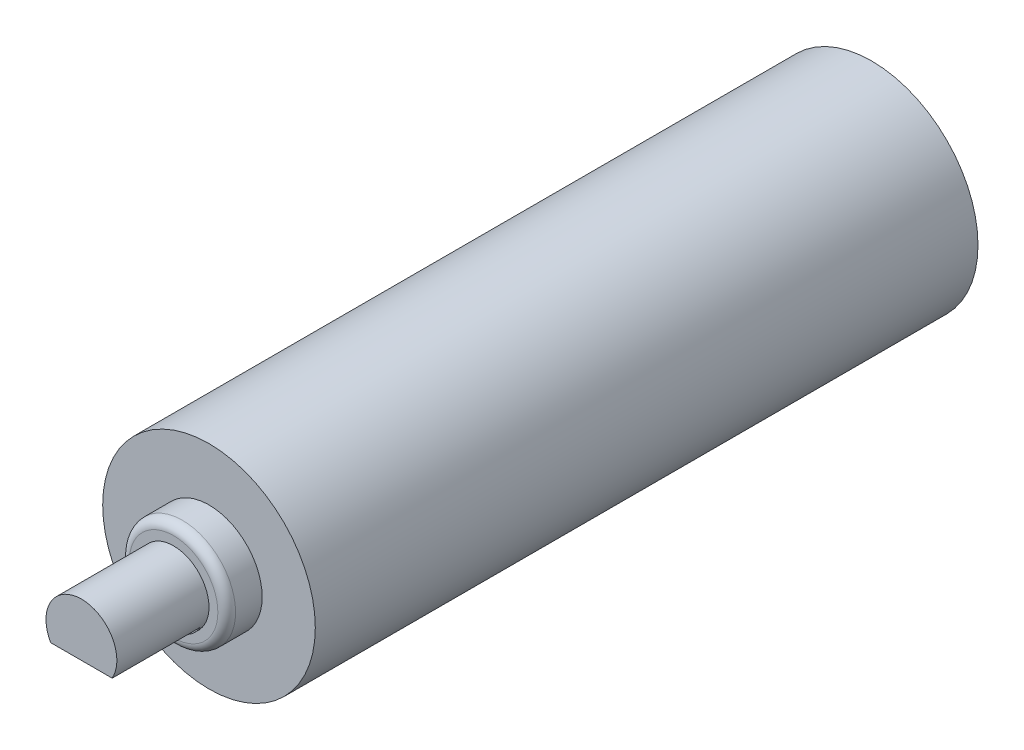
ISO-10303-21;
HEADER;
FILE_DESCRIPTION(('STEP AP214'),'2;1');
FILE_NAME('part.step','',(''),(''),'','','');
FILE_SCHEMA(('AUTOMOTIVE_DESIGN { 1 0 10303 214 1 1 1 1 }'));
ENDSEC;
DATA;
#1=APPLICATION_CONTEXT('core data for automotive mechanical design processes');
#2=APPLICATION_PROTOCOL_DEFINITION('international standard','automotive_design',2000,#1);
#3=PRODUCT_CONTEXT('',#1,'mechanical');
#4=PRODUCT('Part','Part','',(#3));
#5=PRODUCT_RELATED_PRODUCT_CATEGORY('part','',(#4));
#6=PRODUCT_DEFINITION_FORMATION('','',#4);
#7=PRODUCT_DEFINITION_CONTEXT('part definition',#1,'design');
#8=PRODUCT_DEFINITION('design','',#6,#7);
#9=PRODUCT_DEFINITION_SHAPE('','',#8);
#10=(LENGTH_UNIT() NAMED_UNIT(*) SI_UNIT(.MILLI.,.METRE.));
#11=(NAMED_UNIT(*) PLANE_ANGLE_UNIT() SI_UNIT($,.RADIAN.));
#12=(NAMED_UNIT(*) SI_UNIT($,.STERADIAN.) SOLID_ANGLE_UNIT());
#13=UNCERTAINTY_MEASURE_WITH_UNIT(LENGTH_MEASURE(1.E-05),#10,'distance_accuracy_value','');
#14=(GEOMETRIC_REPRESENTATION_CONTEXT(3) GLOBAL_UNCERTAINTY_ASSIGNED_CONTEXT((#13)) GLOBAL_UNIT_ASSIGNED_CONTEXT((#10,
#11,#12)) REPRESENTATION_CONTEXT('',''));
#15=CARTESIAN_POINT('',(0.,0.,0.));
#16=DIRECTION('',(0.,0.,1.));
#17=DIRECTION('',(1.,0.,0.));
#18=AXIS2_PLACEMENT_3D('',#15,#16,#17);
#19=CARTESIAN_POINT('',(0.,0.,-18.7));
#20=DIRECTION('',(0.,0.,1.));
#21=DIRECTION('',(1.,0.,0.));
#22=AXIS2_PLACEMENT_3D('',#19,#20,#21);
#23=CYLINDRICAL_SURFACE('',#22,3.);
#24=CARTESIAN_POINT('',(0.,0.,-18.7));
#25=DIRECTION('',(0.,0.,1.));
#26=DIRECTION('',(1.,0.,0.));
#27=AXIS2_PLACEMENT_3D('',#24,#25,#26);
#28=CIRCLE('',#27,3.);
#29=CARTESIAN_POINT('',(3.,0.,-18.7));
#30=VERTEX_POINT('',#29);
#31=EDGE_CURVE('E99',#30,#30,#28,.T.);
#32=ORIENTED_EDGE('',*,*,#31,.T.);
#33=EDGE_LOOP('',(#32));
#34=FACE_BOUND('',#33,.T.);
#35=CARTESIAN_POINT('',(0.,0.,0.));
#36=DIRECTION('',(0.,0.,1.));
#37=DIRECTION('',(1.,0.,0.));
#38=AXIS2_PLACEMENT_3D('',#35,#36,#37);
#39=CIRCLE('',#38,3.);
#40=CARTESIAN_POINT('',(3.,0.,0.));
#41=VERTEX_POINT('',#40);
#42=EDGE_CURVE('E92',#41,#41,#39,.T.);
#43=ORIENTED_EDGE('',*,*,#42,.F.);
#44=EDGE_LOOP('',(#43));
#45=FACE_BOUND('',#44,.T.);
#46=ADVANCED_FACE('F33',(#34,#45),#23,.T.);
#47=CARTESIAN_POINT('',(0.,0.,-18.7));
#48=DIRECTION('',(0.,0.,1.));
#49=DIRECTION('',(1.,0.,0.));
#50=AXIS2_PLACEMENT_3D('',#47,#48,#49);
#51=PLANE('',#50);
#52=ORIENTED_EDGE('',*,*,#31,.F.);
#53=EDGE_LOOP('',(#52));
#54=FACE_BOUND('',#53,.T.);
#55=ADVANCED_FACE('F119',(#54),#51,.F.);
#56=CARTESIAN_POINT('',(0.,0.,0.));
#57=DIRECTION('',(0.,0.,1.));
#58=DIRECTION('',(1.,0.,0.));
#59=AXIS2_PLACEMENT_3D('',#56,#57,#58);
#60=PLANE('',#59);
#61=CARTESIAN_POINT('',(0.,0.,0.));
#62=DIRECTION('',(0.,0.,1.));
#63=DIRECTION('',(1.,0.,0.));
#64=AXIS2_PLACEMENT_3D('',#61,#62,#63);
#65=CIRCLE('',#64,1.5);
#66=CARTESIAN_POINT('',(1.5,0.,0.));
#67=VERTEX_POINT('',#66);
#68=EDGE_CURVE('E96',#67,#67,#65,.T.);
#69=ORIENTED_EDGE('',*,*,#68,.F.);
#70=EDGE_LOOP('',(#69));
#71=FACE_BOUND('',#70,.T.);
#72=ORIENTED_EDGE('',*,*,#42,.T.);
#73=EDGE_LOOP('',(#72));
#74=FACE_BOUND('',#73,.T.);
#75=ADVANCED_FACE('F124',(#71,#74),#60,.T.);
#76=CARTESIAN_POINT('',(0.,0.,1.));
#77=DIRECTION('',(0.,0.,-1.));
#78=DIRECTION('',(-1.,0.,0.));
#79=AXIS2_PLACEMENT_3D('',#76,#77,#78);
#80=CYLINDRICAL_SURFACE('',#79,1.5);
#81=CARTESIAN_POINT('',(0.,0.,0.75));
#82=DIRECTION('',(0.,0.,1.));
#83=DIRECTION('',(1.,0.,0.));
#84=AXIS2_PLACEMENT_3D('',#81,#82,#83);
#85=CIRCLE('',#84,1.5);
#86=CARTESIAN_POINT('',(1.5,0.,0.75));
#87=VERTEX_POINT('',#86);
#88=EDGE_CURVE('E11',#87,#87,#85,.F.);
#89=ORIENTED_EDGE('',*,*,#88,.T.);
#90=EDGE_LOOP('',(#89));
#91=FACE_BOUND('',#90,.T.);
#92=ORIENTED_EDGE('',*,*,#68,.T.);
#93=EDGE_LOOP('',(#92));
#94=FACE_BOUND('',#93,.T.);
#95=ADVANCED_FACE('F130',(#91,#94),#80,.T.);
#96=CARTESIAN_POINT('',(0.,0.,1.));
#97=DIRECTION('',(0.,0.,1.));
#98=DIRECTION('',(1.,0.,0.));
#99=AXIS2_PLACEMENT_3D('',#96,#97,#98);
#100=PLANE('',#99);
#101=CARTESIAN_POINT('',(0.,0.,1.));
#102=DIRECTION('',(0.,0.,1.));
#103=DIRECTION('',(1.,0.,0.));
#104=AXIS2_PLACEMENT_3D('',#101,#102,#103);
#105=CIRCLE('',#104,1.25);
#106=CARTESIAN_POINT('',(1.25,0.,1.));
#107=VERTEX_POINT('',#106);
#108=EDGE_CURVE('E41',#107,#107,#105,.T.);
#109=ORIENTED_EDGE('',*,*,#108,.T.);
#110=EDGE_LOOP('',(#109));
#111=FACE_BOUND('',#110,.T.);
#112=CARTESIAN_POINT('',(0.,0.,1.));
#113=DIRECTION('',(0.,0.,1.));
#114=DIRECTION('',(1.,0.,0.));
#115=AXIS2_PLACEMENT_3D('',#112,#113,#114);
#116=CIRCLE('',#115,1.);
#117=CARTESIAN_POINT('',(1.,0.,1.));
#118=VERTEX_POINT('',#117);
#119=EDGE_CURVE('E93',#118,#118,#116,.T.);
#120=ORIENTED_EDGE('',*,*,#119,.F.);
#121=EDGE_LOOP('',(#120));
#122=FACE_BOUND('',#121,.T.);
#123=ADVANCED_FACE('F108',(#111,#122),#100,.T.);
#124=CARTESIAN_POINT('',(0.,0.,3.6));
#125=DIRECTION('',(0.,0.,-1.));
#126=DIRECTION('',(-1.,0.,0.));
#127=AXIS2_PLACEMENT_3D('',#124,#125,#126);
#128=CYLINDRICAL_SURFACE('',#127,1.);
#129=CARTESIAN_POINT('',(0.,0.,1.1));
#130=DIRECTION('',(0.,0.,1.));
#131=DIRECTION('',(1.,0.,0.));
#132=AXIS2_PLACEMENT_3D('',#129,#130,#131);
#133=CIRCLE('',#132,1.);
#134=CARTESIAN_POINT('',(-0.866025403784439,-0.5,1.1));
#135=VERTEX_POINT('',#134);
#136=CARTESIAN_POINT('',(0.862464594948922,-0.50611739987832,1.1));
#137=VERTEX_POINT('',#136);
#138=EDGE_CURVE('E55',#135,#137,#133,.T.);
#139=ORIENTED_EDGE('',*,*,#138,.F.);
#140=DIRECTION('',(0.,0.,-1.));
#141=VECTOR('',#140,1.);
#142=CARTESIAN_POINT('',(-0.866025403784439,-0.5,3.6));
#143=LINE('',#142,#141);
#144=CARTESIAN_POINT('',(-0.866025403784438,-0.5,3.6));
#145=VERTEX_POINT('',#144);
#146=EDGE_CURVE('E79',#135,#145,#143,.F.);
#147=ORIENTED_EDGE('',*,*,#146,.T.);
#148=CARTESIAN_POINT('',(0.,0.,3.6));
#149=DIRECTION('',(0.,0.,1.));
#150=DIRECTION('',(1.,0.,0.));
#151=AXIS2_PLACEMENT_3D('',#148,#149,#150);
#152=CIRCLE('',#151,1.);
#153=CARTESIAN_POINT('',(0.862464594948922,-0.50611739987832,3.6));
#154=VERTEX_POINT('',#153);
#155=EDGE_CURVE('E89',#154,#145,#152,.T.);
#156=ORIENTED_EDGE('',*,*,#155,.F.);
#157=DIRECTION('',(0.,0.,-1.));
#158=VECTOR('',#157,1.);
#159=CARTESIAN_POINT('',(0.862464594948922,-0.50611739987832,3.6));
#160=LINE('',#159,#158);
#161=EDGE_CURVE('E48',#154,#137,#160,.T.);
#162=ORIENTED_EDGE('',*,*,#161,.T.);
#163=EDGE_LOOP('',(#139,#147,#156,#162));
#164=FACE_BOUND('',#163,.T.);
#165=ORIENTED_EDGE('',*,*,#119,.T.);
#166=EDGE_LOOP('',(#165));
#167=FACE_BOUND('',#166,.T.);
#168=ADVANCED_FACE('F138',(#164,#167),#128,.T.);
#169=CARTESIAN_POINT('',(0.,0.,3.6));
#170=DIRECTION('',(0.,0.,1.));
#171=DIRECTION('',(1.,0.,0.));
#172=AXIS2_PLACEMENT_3D('',#169,#170,#171);
#173=PLANE('',#172);
#174=DIRECTION('',(-1.,0.,0.));
#175=VECTOR('',#174,1.);
#176=CARTESIAN_POINT('',(0.,-0.5,3.6));
#177=LINE('',#176,#175);
#178=CARTESIAN_POINT('',(0.862464594948922,-0.5,3.6));
#179=VERTEX_POINT('',#178);
#180=EDGE_CURVE('E80',#179,#145,#177,.T.);
#181=ORIENTED_EDGE('',*,*,#180,.F.);
#182=DIRECTION('',(0.,1.,0.));
#183=VECTOR('',#182,1.);
#184=CARTESIAN_POINT('',(0.862464594948922,0.,3.6));
#185=LINE('',#184,#183);
#186=EDGE_CURVE('E83',#154,#179,#185,.T.);
#187=ORIENTED_EDGE('',*,*,#186,.F.);
#188=ORIENTED_EDGE('',*,*,#155,.T.);
#189=EDGE_LOOP('',(#181,#187,#188));
#190=FACE_BOUND('',#189,.T.);
#191=ADVANCED_FACE('F141',(#190),#173,.T.);
#192=CARTESIAN_POINT('',(0.,0.,1.1));
#193=DIRECTION('',(0.,0.,1.));
#194=DIRECTION('',(1.,0.,0.));
#195=AXIS2_PLACEMENT_3D('',#192,#193,#194);
#196=PLANE('',#195);
#197=DIRECTION('',(-1.,0.,0.));
#198=VECTOR('',#197,1.);
#199=CARTESIAN_POINT('',(0.,-0.5,1.1));
#200=LINE('',#199,#198);
#201=CARTESIAN_POINT('',(0.862464594948922,-0.5,1.1));
#202=VERTEX_POINT('',#201);
#203=EDGE_CURVE('E71',#202,#135,#200,.T.);
#204=ORIENTED_EDGE('',*,*,#203,.T.);
#205=ORIENTED_EDGE('',*,*,#138,.T.);
#206=DIRECTION('',(0.,1.,0.));
#207=VECTOR('',#206,1.);
#208=CARTESIAN_POINT('',(0.862464594948922,-0.5,1.1));
#209=LINE('',#208,#207);
#210=EDGE_CURVE('E68',#137,#202,#209,.T.);
#211=ORIENTED_EDGE('',*,*,#210,.T.);
#212=EDGE_LOOP('',(#204,#205,#211));
#213=FACE_BOUND('',#212,.T.);
#214=ADVANCED_FACE('F70',(#213),#196,.T.);
#215=CARTESIAN_POINT('',(0.,-0.5,1.1));
#216=DIRECTION('',(0.,1.,0.));
#217=DIRECTION('',(0.,0.,1.));
#218=AXIS2_PLACEMENT_3D('',#215,#216,#217);
#219=PLANE('',#218);
#220=ORIENTED_EDGE('',*,*,#203,.F.);
#221=DIRECTION('',(0.,0.,1.));
#222=VECTOR('',#221,1.);
#223=CARTESIAN_POINT('',(0.862464594948922,-0.5,1.1));
#224=LINE('',#223,#222);
#225=EDGE_CURVE('E73',#202,#179,#224,.T.);
#226=ORIENTED_EDGE('',*,*,#225,.T.);
#227=ORIENTED_EDGE('',*,*,#180,.T.);
#228=ORIENTED_EDGE('',*,*,#146,.F.);
#229=EDGE_LOOP('',(#220,#226,#227,#228));
#230=FACE_BOUND('',#229,.T.);
#231=ADVANCED_FACE('F77',(#230),#219,.F.);
#232=CARTESIAN_POINT('',(0.862464594948922,-0.5,1.1));
#233=DIRECTION('',(1.,0.,0.));
#234=DIRECTION('',(0.,0.,-1.));
#235=AXIS2_PLACEMENT_3D('',#232,#233,#234);
#236=PLANE('',#235);
#237=ORIENTED_EDGE('',*,*,#186,.T.);
#238=ORIENTED_EDGE('',*,*,#225,.F.);
#239=ORIENTED_EDGE('',*,*,#210,.F.);
#240=ORIENTED_EDGE('',*,*,#161,.F.);
#241=EDGE_LOOP('',(#237,#238,#239,#240));
#242=FACE_BOUND('',#241,.T.);
#243=ADVANCED_FACE('F82',(#242),#236,.F.);
#244=CARTESIAN_POINT('',(0.,0.,0.75));
#245=DIRECTION('',(0.,0.,1.));
#246=DIRECTION('',(1.,0.,0.));
#247=AXIS2_PLACEMENT_3D('',#244,#245,#246);
#248=TOROIDAL_SURFACE('',#247,1.25,0.25);
#249=ORIENTED_EDGE('',*,*,#88,.F.);
#250=EDGE_LOOP('',(#249));
#251=FACE_BOUND('',#250,.T.);
#252=ORIENTED_EDGE('',*,*,#108,.F.);
#253=EDGE_LOOP('',(#252));
#254=FACE_BOUND('',#253,.T.);
#255=ADVANCED_FACE('F35',(#251,#254),#248,.T.);
#256=CLOSED_SHELL('',(#46,#55,#75,#95,#123,#168,#191,#214,#231,#243,#255));
#257=MANIFOLD_SOLID_BREP('B2',#256);
#258=ADVANCED_BREP_SHAPE_REPRESENTATION('',(#18,#257),#14);
#259=SHAPE_DEFINITION_REPRESENTATION(#9,#258);
ENDSEC;
END-ISO-10303-21;
